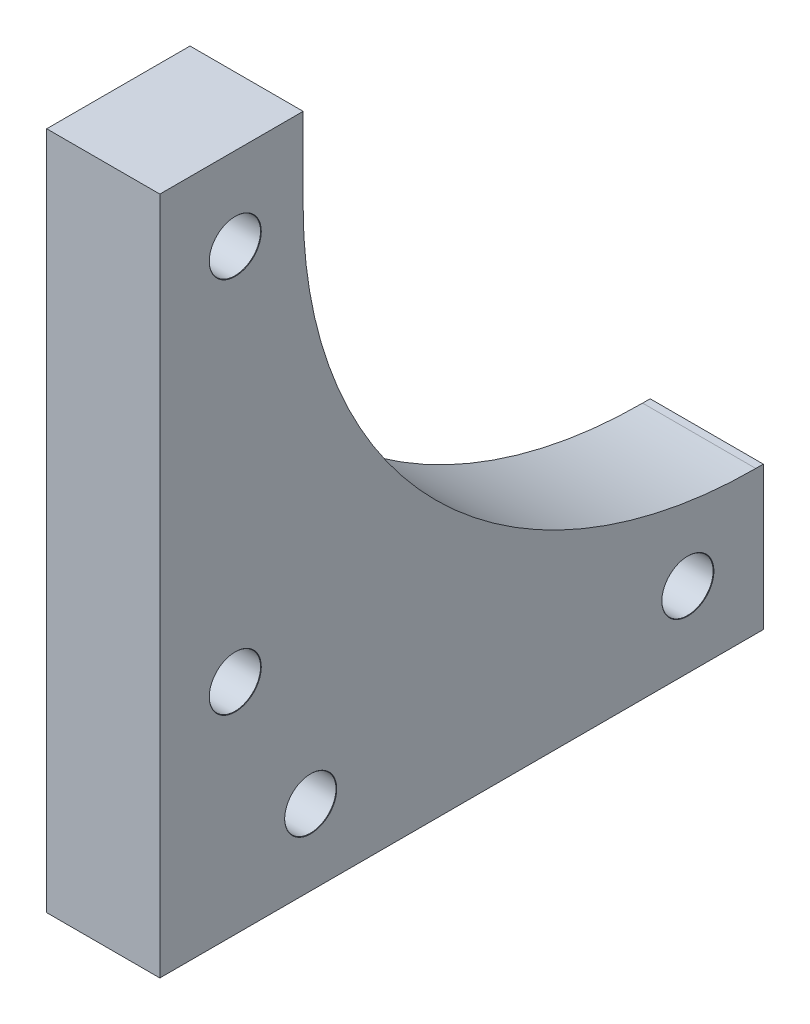
ISO-10303-21;
HEADER;
FILE_DESCRIPTION(('STEP AP214'),'2;1');
FILE_NAME('part.step','',(''),(''),'','','');
FILE_SCHEMA(('AUTOMOTIVE_DESIGN { 1 0 10303 214 1 1 1 1 }'));
ENDSEC;
DATA;
#1=APPLICATION_CONTEXT('core data for automotive mechanical design processes');
#2=APPLICATION_PROTOCOL_DEFINITION('international standard','automotive_design',2000,#1);
#3=PRODUCT_CONTEXT('',#1,'mechanical');
#4=PRODUCT('Part','Part','',(#3));
#5=PRODUCT_RELATED_PRODUCT_CATEGORY('part','',(#4));
#6=PRODUCT_DEFINITION_FORMATION('','',#4);
#7=PRODUCT_DEFINITION_CONTEXT('part definition',#1,'design');
#8=PRODUCT_DEFINITION('design','',#6,#7);
#9=PRODUCT_DEFINITION_SHAPE('','',#8);
#10=(LENGTH_UNIT() NAMED_UNIT(*) SI_UNIT(.MILLI.,.METRE.));
#11=(NAMED_UNIT(*) PLANE_ANGLE_UNIT() SI_UNIT($,.RADIAN.));
#12=(NAMED_UNIT(*) SI_UNIT($,.STERADIAN.) SOLID_ANGLE_UNIT());
#13=UNCERTAINTY_MEASURE_WITH_UNIT(LENGTH_MEASURE(1.E-05),#10,'distance_accuracy_value','');
#14=(GEOMETRIC_REPRESENTATION_CONTEXT(3) GLOBAL_UNCERTAINTY_ASSIGNED_CONTEXT((#13)) GLOBAL_UNIT_ASSIGNED_CONTEXT((#10,
#11,#12)) REPRESENTATION_CONTEXT('',''));
#15=CARTESIAN_POINT('',(0.,0.,0.));
#16=DIRECTION('',(0.,0.,1.));
#17=DIRECTION('',(1.,0.,0.));
#18=AXIS2_PLACEMENT_3D('',#15,#16,#17);
#19=CARTESIAN_POINT('',(7.5,0.,-40.));
#20=DIRECTION('',(0.,1.,0.));
#21=DIRECTION('',(0.,0.,1.));
#22=AXIS2_PLACEMENT_3D('',#19,#20,#21);
#23=PLANE('',#22);
#24=DIRECTION('',(0.,0.,-1.));
#25=VECTOR('',#24,1.);
#26=CARTESIAN_POINT('',(0.,0.,-40.));
#27=LINE('',#26,#25);
#28=CARTESIAN_POINT('',(0.,0.,0.));
#29=VERTEX_POINT('',#28);
#30=CARTESIAN_POINT('',(0.,0.,-40.));
#31=VERTEX_POINT('',#30);
#32=EDGE_CURVE('E123',#29,#31,#27,.T.);
#33=ORIENTED_EDGE('',*,*,#32,.T.);
#34=DIRECTION('',(-1.,0.,0.));
#35=VECTOR('',#34,1.);
#36=CARTESIAN_POINT('',(7.5,0.,-40.));
#37=LINE('',#36,#35);
#38=CARTESIAN_POINT('',(7.5,0.,-40.));
#39=VERTEX_POINT('',#38);
#40=EDGE_CURVE('E103',#39,#31,#37,.T.);
#41=ORIENTED_EDGE('',*,*,#40,.F.);
#42=DIRECTION('',(0.,0.,-1.));
#43=VECTOR('',#42,1.);
#44=CARTESIAN_POINT('',(7.5,0.,-40.));
#45=LINE('',#44,#43);
#46=CARTESIAN_POINT('',(7.5,0.,0.));
#47=VERTEX_POINT('',#46);
#48=EDGE_CURVE('E110',#47,#39,#45,.T.);
#49=ORIENTED_EDGE('',*,*,#48,.F.);
#50=DIRECTION('',(-1.,0.,0.));
#51=VECTOR('',#50,1.);
#52=CARTESIAN_POINT('',(7.5,0.,0.));
#53=LINE('',#52,#51);
#54=EDGE_CURVE('E144',#47,#29,#53,.T.);
#55=ORIENTED_EDGE('',*,*,#54,.T.);
#56=EDGE_LOOP('',(#33,#41,#49,#55));
#57=FACE_BOUND('',#56,.T.);
#58=ADVANCED_FACE('F39',(#57),#23,.F.);
#59=CARTESIAN_POINT('',(7.5,9.5,-40.));
#60=DIRECTION('',(0.,0.,1.));
#61=DIRECTION('',(1.,0.,0.));
#62=AXIS2_PLACEMENT_3D('',#59,#60,#61);
#63=PLANE('',#62);
#64=DIRECTION('',(0.,1.,0.));
#65=VECTOR('',#64,1.);
#66=CARTESIAN_POINT('',(0.,9.5,-40.));
#67=LINE('',#66,#65);
#68=CARTESIAN_POINT('',(0.,9.5,-40.));
#69=VERTEX_POINT('',#68);
#70=EDGE_CURVE('E158',#31,#69,#67,.T.);
#71=ORIENTED_EDGE('',*,*,#70,.T.);
#72=DIRECTION('',(-1.,0.,0.));
#73=VECTOR('',#72,1.);
#74=CARTESIAN_POINT('',(7.5,9.5,-40.));
#75=LINE('',#74,#73);
#76=CARTESIAN_POINT('',(7.5,9.5,-40.));
#77=VERTEX_POINT('',#76);
#78=EDGE_CURVE('E106',#77,#69,#75,.T.);
#79=ORIENTED_EDGE('',*,*,#78,.F.);
#80=DIRECTION('',(0.,1.,0.));
#81=VECTOR('',#80,1.);
#82=CARTESIAN_POINT('',(7.5,9.5,-40.));
#83=LINE('',#82,#81);
#84=EDGE_CURVE('E99',#39,#77,#83,.T.);
#85=ORIENTED_EDGE('',*,*,#84,.F.);
#86=ORIENTED_EDGE('',*,*,#40,.T.);
#87=EDGE_LOOP('',(#71,#79,#85,#86));
#88=FACE_BOUND('',#87,.T.);
#89=ADVANCED_FACE('F101',(#88),#63,.F.);
#90=CARTESIAN_POINT('',(7.5,9.5,-9.50000000000001));
#91=DIRECTION('',(0.,-1.,0.));
#92=DIRECTION('',(0.,0.,-1.));
#93=AXIS2_PLACEMENT_3D('',#90,#91,#92);
#94=PLANE('',#93);
#95=DIRECTION('',(0.,0.,1.));
#96=VECTOR('',#95,1.);
#97=CARTESIAN_POINT('',(0.,9.5,-9.50000000000001));
#98=LINE('',#97,#96);
#99=CARTESIAN_POINT('',(0.,9.5,-39.5));
#100=VERTEX_POINT('',#99);
#101=EDGE_CURVE('E155',#69,#100,#98,.T.);
#102=ORIENTED_EDGE('',*,*,#101,.T.);
#103=DIRECTION('',(-1.,0.,0.));
#104=VECTOR('',#103,1.);
#105=CARTESIAN_POINT('',(7.5,9.5,-39.5));
#106=LINE('',#105,#104);
#107=CARTESIAN_POINT('',(7.5,9.5,-39.5));
#108=VERTEX_POINT('',#107);
#109=EDGE_CURVE('E55',#100,#108,#106,.F.);
#110=ORIENTED_EDGE('',*,*,#109,.T.);
#111=DIRECTION('',(0.,0.,1.));
#112=VECTOR('',#111,1.);
#113=CARTESIAN_POINT('',(7.5,9.5,-9.50000000000001));
#114=LINE('',#113,#112);
#115=EDGE_CURVE('E109',#77,#108,#114,.T.);
#116=ORIENTED_EDGE('',*,*,#115,.F.);
#117=ORIENTED_EDGE('',*,*,#78,.T.);
#118=EDGE_LOOP('',(#102,#110,#116,#117));
#119=FACE_BOUND('',#118,.T.);
#120=ADVANCED_FACE('F255',(#119),#94,.F.);
#121=CARTESIAN_POINT('',(7.5,45.,-9.5));
#122=DIRECTION('',(0.,0.,1.));
#123=DIRECTION('',(0.,-1.,0.));
#124=AXIS2_PLACEMENT_3D('',#121,#122,#123);
#125=PLANE('',#124);
#126=DIRECTION('',(0.,1.,0.));
#127=VECTOR('',#126,1.);
#128=CARTESIAN_POINT('',(7.5,45.,-9.5));
#129=LINE('',#128,#127);
#130=CARTESIAN_POINT('',(7.5,39.5,-9.5));
#131=VERTEX_POINT('',#130);
#132=CARTESIAN_POINT('',(7.5,45.,-9.5));
#133=VERTEX_POINT('',#132);
#134=EDGE_CURVE('E169',#131,#133,#129,.T.);
#135=ORIENTED_EDGE('',*,*,#134,.F.);
#136=DIRECTION('',(-1.,0.,0.));
#137=VECTOR('',#136,1.);
#138=CARTESIAN_POINT('',(0.,39.5,-9.5));
#139=LINE('',#138,#137);
#140=CARTESIAN_POINT('',(0.,39.5,-9.5));
#141=VERTEX_POINT('',#140);
#142=EDGE_CURVE('E125',#131,#141,#139,.T.);
#143=ORIENTED_EDGE('',*,*,#142,.T.);
#144=DIRECTION('',(0.,1.,0.));
#145=VECTOR('',#144,1.);
#146=CARTESIAN_POINT('',(0.,45.,-9.5));
#147=LINE('',#146,#145);
#148=CARTESIAN_POINT('',(0.,45.,-9.5));
#149=VERTEX_POINT('',#148);
#150=EDGE_CURVE('E152',#141,#149,#147,.T.);
#151=ORIENTED_EDGE('',*,*,#150,.T.);
#152=DIRECTION('',(-1.,0.,0.));
#153=VECTOR('',#152,1.);
#154=CARTESIAN_POINT('',(7.5,45.,-9.5));
#155=LINE('',#154,#153);
#156=EDGE_CURVE('E131',#133,#149,#155,.T.);
#157=ORIENTED_EDGE('',*,*,#156,.F.);
#158=EDGE_LOOP('',(#135,#143,#151,#157));
#159=FACE_BOUND('',#158,.T.);
#160=ADVANCED_FACE('F260',(#159),#125,.F.);
#161=CARTESIAN_POINT('',(7.5,45.,0.));
#162=DIRECTION('',(0.,-1.,0.));
#163=DIRECTION('',(0.,0.,-1.));
#164=AXIS2_PLACEMENT_3D('',#161,#162,#163);
#165=PLANE('',#164);
#166=DIRECTION('',(0.,0.,1.));
#167=VECTOR('',#166,1.);
#168=CARTESIAN_POINT('',(0.,45.,0.));
#169=LINE('',#168,#167);
#170=CARTESIAN_POINT('',(0.,45.,0.));
#171=VERTEX_POINT('',#170);
#172=EDGE_CURVE('E149',#149,#171,#169,.T.);
#173=ORIENTED_EDGE('',*,*,#172,.T.);
#174=DIRECTION('',(-1.,0.,0.));
#175=VECTOR('',#174,1.);
#176=CARTESIAN_POINT('',(7.5,45.,0.));
#177=LINE('',#176,#175);
#178=CARTESIAN_POINT('',(7.5,45.,0.));
#179=VERTEX_POINT('',#178);
#180=EDGE_CURVE('E140',#179,#171,#177,.T.);
#181=ORIENTED_EDGE('',*,*,#180,.F.);
#182=DIRECTION('',(0.,0.,1.));
#183=VECTOR('',#182,1.);
#184=CARTESIAN_POINT('',(7.5,45.,0.));
#185=LINE('',#184,#183);
#186=EDGE_CURVE('E166',#133,#179,#185,.T.);
#187=ORIENTED_EDGE('',*,*,#186,.F.);
#188=ORIENTED_EDGE('',*,*,#156,.T.);
#189=EDGE_LOOP('',(#173,#181,#187,#188));
#190=FACE_BOUND('',#189,.T.);
#191=ADVANCED_FACE('F263',(#190),#165,.F.);
#192=CARTESIAN_POINT('',(7.5,0.,0.));
#193=DIRECTION('',(0.,0.,-1.));
#194=DIRECTION('',(-1.,0.,0.));
#195=AXIS2_PLACEMENT_3D('',#192,#193,#194);
#196=PLANE('',#195);
#197=DIRECTION('',(0.,-1.,0.));
#198=VECTOR('',#197,1.);
#199=CARTESIAN_POINT('',(0.,0.,0.));
#200=LINE('',#199,#198);
#201=EDGE_CURVE('E120',#171,#29,#200,.T.);
#202=ORIENTED_EDGE('',*,*,#201,.T.);
#203=ORIENTED_EDGE('',*,*,#54,.F.);
#204=DIRECTION('',(0.,-1.,0.));
#205=VECTOR('',#204,1.);
#206=CARTESIAN_POINT('',(7.5,0.,0.));
#207=LINE('',#206,#205);
#208=EDGE_CURVE('E115',#179,#47,#207,.T.);
#209=ORIENTED_EDGE('',*,*,#208,.F.);
#210=ORIENTED_EDGE('',*,*,#180,.T.);
#211=EDGE_LOOP('',(#202,#203,#209,#210));
#212=FACE_BOUND('',#211,.T.);
#213=ADVANCED_FACE('F227',(#212),#196,.F.);
#214=CARTESIAN_POINT('',(7.5,0.,0.));
#215=DIRECTION('',(-1.,0.,0.));
#216=DIRECTION('',(0.,0.,1.));
#217=AXIS2_PLACEMENT_3D('',#214,#215,#216);
#218=PLANE('',#217);
#219=CARTESIAN_POINT('',(7.5,5.,-35.));
#220=DIRECTION('',(1.,0.,0.));
#221=DIRECTION('',(0.,0.,-1.));
#222=AXIS2_PLACEMENT_3D('',#219,#220,#221);
#223=CIRCLE('',#222,1.725);
#224=CARTESIAN_POINT('',(7.5,5.,-36.725));
#225=VERTEX_POINT('',#224);
#226=EDGE_CURVE('E217',#225,#225,#223,.T.);
#227=ORIENTED_EDGE('',*,*,#226,.F.);
#228=EDGE_LOOP('',(#227));
#229=FACE_BOUND('',#228,.T.);
#230=CARTESIAN_POINT('',(7.5,5.,-10.));
#231=DIRECTION('',(1.,0.,0.));
#232=DIRECTION('',(0.,0.,-1.));
#233=AXIS2_PLACEMENT_3D('',#230,#231,#232);
#234=CIRCLE('',#233,1.725);
#235=CARTESIAN_POINT('',(7.5,5.,-11.725));
#236=VERTEX_POINT('',#235);
#237=EDGE_CURVE('E205',#236,#236,#234,.T.);
#238=ORIENTED_EDGE('',*,*,#237,.F.);
#239=EDGE_LOOP('',(#238));
#240=FACE_BOUND('',#239,.T.);
#241=CARTESIAN_POINT('',(7.5,39.5,-5.00000000000001));
#242=DIRECTION('',(1.,0.,0.));
#243=DIRECTION('',(0.,0.,-1.));
#244=AXIS2_PLACEMENT_3D('',#241,#242,#243);
#245=CIRCLE('',#244,1.725);
#246=CARTESIAN_POINT('',(7.5,39.5,-6.725));
#247=VERTEX_POINT('',#246);
#248=EDGE_CURVE('E193',#247,#247,#245,.T.);
#249=ORIENTED_EDGE('',*,*,#248,.F.);
#250=EDGE_LOOP('',(#249));
#251=FACE_BOUND('',#250,.T.);
#252=CARTESIAN_POINT('',(7.5,14.5,-5.));
#253=DIRECTION('',(1.,0.,0.));
#254=DIRECTION('',(0.,0.,-1.));
#255=AXIS2_PLACEMENT_3D('',#252,#253,#254);
#256=CIRCLE('',#255,1.725);
#257=CARTESIAN_POINT('',(7.5,14.5,-6.725));
#258=VERTEX_POINT('',#257);
#259=EDGE_CURVE('E181',#258,#258,#256,.T.);
#260=ORIENTED_EDGE('',*,*,#259,.F.);
#261=EDGE_LOOP('',(#260));
#262=FACE_BOUND('',#261,.T.);
#263=ORIENTED_EDGE('',*,*,#48,.T.);
#264=ORIENTED_EDGE('',*,*,#84,.T.);
#265=ORIENTED_EDGE('',*,*,#115,.T.);
#266=CARTESIAN_POINT('',(7.5,39.5,-39.5));
#267=DIRECTION('',(-1.,0.,0.));
#268=DIRECTION('',(0.,0.,1.));
#269=AXIS2_PLACEMENT_3D('',#266,#267,#268);
#270=CIRCLE('',#269,30.);
#271=EDGE_CURVE('E11',#108,#131,#270,.T.);
#272=ORIENTED_EDGE('',*,*,#271,.T.);
#273=ORIENTED_EDGE('',*,*,#134,.T.);
#274=ORIENTED_EDGE('',*,*,#186,.T.);
#275=ORIENTED_EDGE('',*,*,#208,.T.);
#276=EDGE_LOOP('',(#263,#264,#265,#272,#273,#274,#275));
#277=FACE_BOUND('',#276,.T.);
#278=ADVANCED_FACE('F113',(#229,#240,#251,#262,#277),#218,.F.);
#279=CARTESIAN_POINT('',(0.,0.,0.));
#280=DIRECTION('',(-1.,0.,0.));
#281=DIRECTION('',(0.,0.,1.));
#282=AXIS2_PLACEMENT_3D('',#279,#280,#281);
#283=PLANE('',#282);
#284=CARTESIAN_POINT('',(0.,5.,-35.));
#285=DIRECTION('',(1.,0.,0.));
#286=DIRECTION('',(0.,0.,-1.));
#287=AXIS2_PLACEMENT_3D('',#284,#285,#286);
#288=CIRCLE('',#287,1.7);
#289=CARTESIAN_POINT('',(0.,5.,-36.7));
#290=VERTEX_POINT('',#289);
#291=EDGE_CURVE('E209',#290,#290,#288,.T.);
#292=ORIENTED_EDGE('',*,*,#291,.T.);
#293=EDGE_LOOP('',(#292));
#294=FACE_BOUND('',#293,.T.);
#295=CARTESIAN_POINT('',(0.,5.,-10.));
#296=DIRECTION('',(1.,0.,0.));
#297=DIRECTION('',(0.,0.,-1.));
#298=AXIS2_PLACEMENT_3D('',#295,#296,#297);
#299=CIRCLE('',#298,1.7);
#300=CARTESIAN_POINT('',(0.,5.,-11.7));
#301=VERTEX_POINT('',#300);
#302=EDGE_CURVE('E197',#301,#301,#299,.T.);
#303=ORIENTED_EDGE('',*,*,#302,.T.);
#304=EDGE_LOOP('',(#303));
#305=FACE_BOUND('',#304,.T.);
#306=CARTESIAN_POINT('',(0.,39.5,-5.00000000000001));
#307=DIRECTION('',(1.,0.,0.));
#308=DIRECTION('',(0.,0.,-1.));
#309=AXIS2_PLACEMENT_3D('',#306,#307,#308);
#310=CIRCLE('',#309,1.7);
#311=CARTESIAN_POINT('',(0.,39.5,-6.70000000000001));
#312=VERTEX_POINT('',#311);
#313=EDGE_CURVE('E185',#312,#312,#310,.T.);
#314=ORIENTED_EDGE('',*,*,#313,.T.);
#315=EDGE_LOOP('',(#314));
#316=FACE_BOUND('',#315,.T.);
#317=CARTESIAN_POINT('',(0.,14.5,-5.));
#318=DIRECTION('',(1.,0.,0.));
#319=DIRECTION('',(0.,0.,-1.));
#320=AXIS2_PLACEMENT_3D('',#317,#318,#319);
#321=CIRCLE('',#320,1.7);
#322=CARTESIAN_POINT('',(0.,14.5,-6.7));
#323=VERTEX_POINT('',#322);
#324=EDGE_CURVE('E163',#323,#323,#321,.T.);
#325=ORIENTED_EDGE('',*,*,#324,.T.);
#326=EDGE_LOOP('',(#325));
#327=FACE_BOUND('',#326,.T.);
#328=ORIENTED_EDGE('',*,*,#32,.F.);
#329=ORIENTED_EDGE('',*,*,#201,.F.);
#330=ORIENTED_EDGE('',*,*,#172,.F.);
#331=ORIENTED_EDGE('',*,*,#150,.F.);
#332=CARTESIAN_POINT('',(0.,39.5,-39.5));
#333=DIRECTION('',(-1.,0.,0.));
#334=DIRECTION('',(0.,0.,1.));
#335=AXIS2_PLACEMENT_3D('',#332,#333,#334);
#336=CIRCLE('',#335,30.);
#337=EDGE_CURVE('E48',#141,#100,#336,.F.);
#338=ORIENTED_EDGE('',*,*,#337,.T.);
#339=ORIENTED_EDGE('',*,*,#101,.F.);
#340=ORIENTED_EDGE('',*,*,#70,.F.);
#341=EDGE_LOOP('',(#328,#329,#330,#331,#338,#339,#340));
#342=FACE_BOUND('',#341,.T.);
#343=ADVANCED_FACE('F226',(#294,#305,#316,#327,#342),#283,.T.);
#344=CARTESIAN_POINT('',(7.5,14.5,-5.));
#345=DIRECTION('',(1.,0.,0.));
#346=DIRECTION('',(0.,0.,-1.));
#347=AXIS2_PLACEMENT_3D('',#344,#345,#346);
#348=CYLINDRICAL_SURFACE('',#347,1.7);
#349=ORIENTED_EDGE('',*,*,#324,.F.);
#350=EDGE_LOOP('',(#349));
#351=FACE_BOUND('',#350,.T.);
#352=CARTESIAN_POINT('',(7.475,14.5,-5.));
#353=DIRECTION('',(1.,0.,0.));
#354=DIRECTION('',(0.,0.,-1.));
#355=AXIS2_PLACEMENT_3D('',#352,#353,#354);
#356=CIRCLE('',#355,1.7);
#357=CARTESIAN_POINT('',(7.475,14.5,-6.7));
#358=VERTEX_POINT('',#357);
#359=EDGE_CURVE('E177',#358,#358,#356,.T.);
#360=ORIENTED_EDGE('',*,*,#359,.T.);
#361=EDGE_LOOP('',(#360));
#362=FACE_BOUND('',#361,.T.);
#363=ADVANCED_FACE('F238',(#351,#362),#348,.F.);
#364=CARTESIAN_POINT('',(7.5,14.5,-5.));
#365=DIRECTION('',(1.,0.,0.));
#366=DIRECTION('',(0.,0.,-1.));
#367=AXIS2_PLACEMENT_3D('',#364,#365,#366);
#368=CONICAL_SURFACE('',#367,1.725,0.785398163397448);
#369=ORIENTED_EDGE('',*,*,#359,.F.);
#370=EDGE_LOOP('',(#369));
#371=FACE_BOUND('',#370,.T.);
#372=ORIENTED_EDGE('',*,*,#259,.T.);
#373=EDGE_LOOP('',(#372));
#374=FACE_BOUND('',#373,.T.);
#375=ADVANCED_FACE('F235',(#371,#374),#368,.F.);
#376=CARTESIAN_POINT('',(7.5,39.5,-5.00000000000001));
#377=DIRECTION('',(1.,0.,0.));
#378=DIRECTION('',(0.,0.,-1.));
#379=AXIS2_PLACEMENT_3D('',#376,#377,#378);
#380=CYLINDRICAL_SURFACE('',#379,1.7);
#381=ORIENTED_EDGE('',*,*,#313,.F.);
#382=EDGE_LOOP('',(#381));
#383=FACE_BOUND('',#382,.T.);
#384=CARTESIAN_POINT('',(7.475,39.5,-5.00000000000001));
#385=DIRECTION('',(1.,0.,0.));
#386=DIRECTION('',(0.,0.,-1.));
#387=AXIS2_PLACEMENT_3D('',#384,#385,#386);
#388=CIRCLE('',#387,1.7);
#389=CARTESIAN_POINT('',(7.475,39.5,-6.70000000000001));
#390=VERTEX_POINT('',#389);
#391=EDGE_CURVE('E189',#390,#390,#388,.T.);
#392=ORIENTED_EDGE('',*,*,#391,.T.);
#393=EDGE_LOOP('',(#392));
#394=FACE_BOUND('',#393,.T.);
#395=ADVANCED_FACE('F237',(#383,#394),#380,.F.);
#396=CARTESIAN_POINT('',(7.5,39.5,-5.00000000000001));
#397=DIRECTION('',(1.,0.,0.));
#398=DIRECTION('',(0.,0.,-1.));
#399=AXIS2_PLACEMENT_3D('',#396,#397,#398);
#400=CONICAL_SURFACE('',#399,1.725,0.785398163397379);
#401=ORIENTED_EDGE('',*,*,#391,.F.);
#402=EDGE_LOOP('',(#401));
#403=FACE_BOUND('',#402,.T.);
#404=ORIENTED_EDGE('',*,*,#248,.T.);
#405=EDGE_LOOP('',(#404));
#406=FACE_BOUND('',#405,.T.);
#407=ADVANCED_FACE('F245',(#403,#406),#400,.F.);
#408=CARTESIAN_POINT('',(7.5,5.,-10.));
#409=DIRECTION('',(1.,0.,0.));
#410=DIRECTION('',(0.,0.,-1.));
#411=AXIS2_PLACEMENT_3D('',#408,#409,#410);
#412=CYLINDRICAL_SURFACE('',#411,1.7);
#413=ORIENTED_EDGE('',*,*,#302,.F.);
#414=EDGE_LOOP('',(#413));
#415=FACE_BOUND('',#414,.T.);
#416=CARTESIAN_POINT('',(7.475,5.,-10.));
#417=DIRECTION('',(1.,0.,0.));
#418=DIRECTION('',(0.,0.,-1.));
#419=AXIS2_PLACEMENT_3D('',#416,#417,#418);
#420=CIRCLE('',#419,1.7);
#421=CARTESIAN_POINT('',(7.475,5.,-11.7));
#422=VERTEX_POINT('',#421);
#423=EDGE_CURVE('E201',#422,#422,#420,.T.);
#424=ORIENTED_EDGE('',*,*,#423,.T.);
#425=EDGE_LOOP('',(#424));
#426=FACE_BOUND('',#425,.T.);
#427=ADVANCED_FACE('F308',(#415,#426),#412,.F.);
#428=CARTESIAN_POINT('',(7.5,5.,-10.));
#429=DIRECTION('',(1.,0.,0.));
#430=DIRECTION('',(0.,0.,-1.));
#431=AXIS2_PLACEMENT_3D('',#428,#429,#430);
#432=CONICAL_SURFACE('',#431,1.725,0.785398163397448);
#433=ORIENTED_EDGE('',*,*,#423,.F.);
#434=EDGE_LOOP('',(#433));
#435=FACE_BOUND('',#434,.T.);
#436=ORIENTED_EDGE('',*,*,#237,.T.);
#437=EDGE_LOOP('',(#436));
#438=FACE_BOUND('',#437,.T.);
#439=ADVANCED_FACE('F301',(#435,#438),#432,.F.);
#440=CARTESIAN_POINT('',(7.5,5.,-35.));
#441=DIRECTION('',(1.,0.,0.));
#442=DIRECTION('',(0.,0.,-1.));
#443=AXIS2_PLACEMENT_3D('',#440,#441,#442);
#444=CYLINDRICAL_SURFACE('',#443,1.7);
#445=ORIENTED_EDGE('',*,*,#291,.F.);
#446=EDGE_LOOP('',(#445));
#447=FACE_BOUND('',#446,.T.);
#448=CARTESIAN_POINT('',(7.475,5.,-35.));
#449=DIRECTION('',(1.,0.,0.));
#450=DIRECTION('',(0.,0.,-1.));
#451=AXIS2_PLACEMENT_3D('',#448,#449,#450);
#452=CIRCLE('',#451,1.7);
#453=CARTESIAN_POINT('',(7.475,5.,-36.7));
#454=VERTEX_POINT('',#453);
#455=EDGE_CURVE('E213',#454,#454,#452,.T.);
#456=ORIENTED_EDGE('',*,*,#455,.T.);
#457=EDGE_LOOP('',(#456));
#458=FACE_BOUND('',#457,.T.);
#459=ADVANCED_FACE('F295',(#447,#458),#444,.F.);
#460=CARTESIAN_POINT('',(7.5,5.,-35.));
#461=DIRECTION('',(1.,0.,0.));
#462=DIRECTION('',(0.,0.,-1.));
#463=AXIS2_PLACEMENT_3D('',#460,#461,#462);
#464=CONICAL_SURFACE('',#463,1.725,0.785398163397448);
#465=ORIENTED_EDGE('',*,*,#455,.F.);
#466=EDGE_LOOP('',(#465));
#467=FACE_BOUND('',#466,.T.);
#468=ORIENTED_EDGE('',*,*,#226,.T.);
#469=EDGE_LOOP('',(#468));
#470=FACE_BOUND('',#469,.T.);
#471=ADVANCED_FACE('F222',(#467,#470),#464,.F.);
#472=CARTESIAN_POINT('',(7.5,39.5,-39.5));
#473=DIRECTION('',(1.,0.,0.));
#474=DIRECTION('',(0.,0.,-1.));
#475=AXIS2_PLACEMENT_3D('',#472,#473,#474);
#476=CYLINDRICAL_SURFACE('',#475,30.);
#477=ORIENTED_EDGE('',*,*,#271,.F.);
#478=ORIENTED_EDGE('',*,*,#109,.F.);
#479=ORIENTED_EDGE('',*,*,#337,.F.);
#480=ORIENTED_EDGE('',*,*,#142,.F.);
#481=EDGE_LOOP('',(#477,#478,#479,#480));
#482=FACE_BOUND('',#481,.T.);
#483=ADVANCED_FACE('F41',(#482),#476,.F.);
#484=CLOSED_SHELL('',(#58,#89,#120,#160,#191,#213,#278,#343,#363,#375,#395,#407,#427,#439,#459,
#471,#483));
#485=MANIFOLD_SOLID_BREP('B2',#484);
#486=ADVANCED_BREP_SHAPE_REPRESENTATION('',(#18,#485),#14);
#487=SHAPE_DEFINITION_REPRESENTATION(#9,#486);
ENDSEC;
END-ISO-10303-21;
